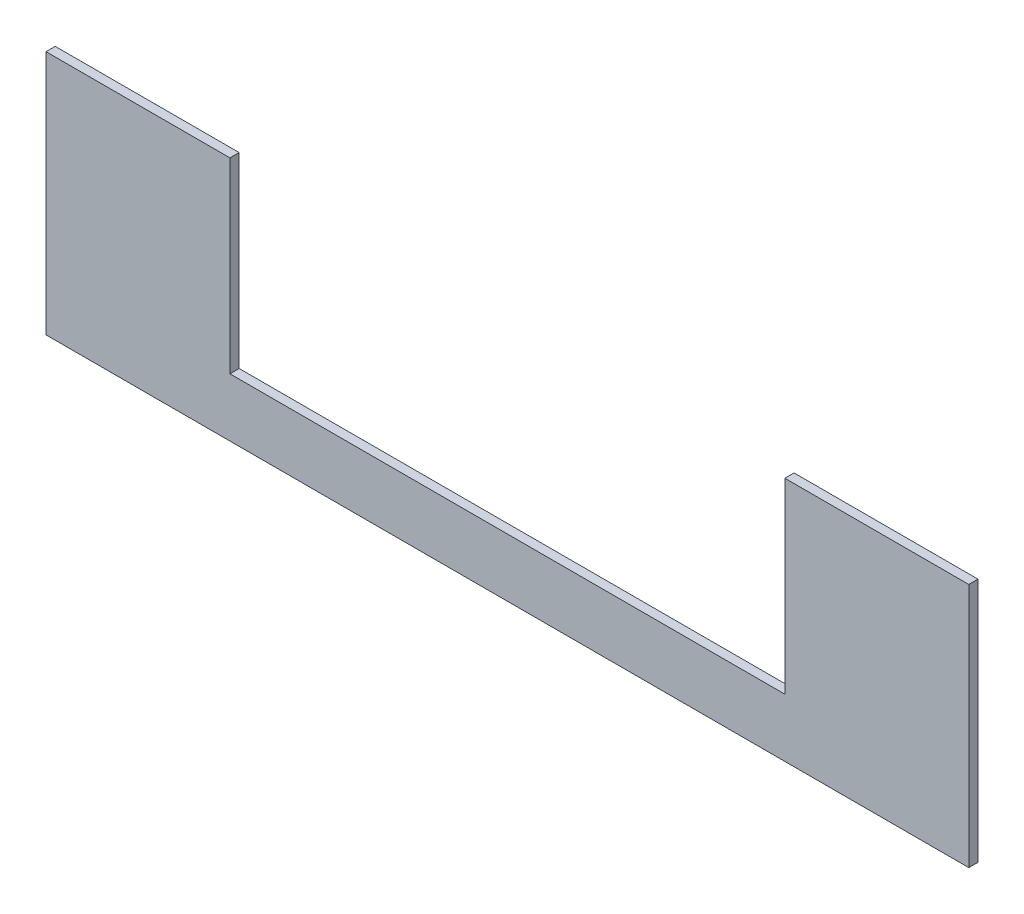
ISO-10303-21;
HEADER;
FILE_DESCRIPTION(('STEP AP214'),'2;1');
FILE_NAME('part.step','',(''),(''),'','','');
FILE_SCHEMA(('AUTOMOTIVE_DESIGN { 1 0 10303 214 1 1 1 1 }'));
ENDSEC;
DATA;
#1=APPLICATION_CONTEXT('core data for automotive mechanical design processes');
#2=APPLICATION_PROTOCOL_DEFINITION('international standard','automotive_design',2000,#1);
#3=PRODUCT_CONTEXT('',#1,'mechanical');
#4=PRODUCT('Part','Part','',(#3));
#5=PRODUCT_RELATED_PRODUCT_CATEGORY('part','',(#4));
#6=PRODUCT_DEFINITION_FORMATION('','',#4);
#7=PRODUCT_DEFINITION_CONTEXT('part definition',#1,'design');
#8=PRODUCT_DEFINITION('design','',#6,#7);
#9=PRODUCT_DEFINITION_SHAPE('','',#8);
#10=(LENGTH_UNIT() NAMED_UNIT(*) SI_UNIT(.MILLI.,.METRE.));
#11=(NAMED_UNIT(*) PLANE_ANGLE_UNIT() SI_UNIT($,.RADIAN.));
#12=(NAMED_UNIT(*) SI_UNIT($,.STERADIAN.) SOLID_ANGLE_UNIT());
#13=UNCERTAINTY_MEASURE_WITH_UNIT(LENGTH_MEASURE(1.E-05),#10,'distance_accuracy_value','');
#14=(GEOMETRIC_REPRESENTATION_CONTEXT(3) GLOBAL_UNCERTAINTY_ASSIGNED_CONTEXT((#13)) GLOBAL_UNIT_ASSIGNED_CONTEXT((#10,
#11,#12)) REPRESENTATION_CONTEXT('',''));
#15=CARTESIAN_POINT('',(0.,0.,0.));
#16=DIRECTION('',(0.,0.,1.));
#17=DIRECTION('',(1.,0.,0.));
#18=AXIS2_PLACEMENT_3D('',#15,#16,#17);
#19=CARTESIAN_POINT('',(0.,80.,3.));
#20=DIRECTION('',(0.,-1.,0.));
#21=DIRECTION('',(1.,0.,0.));
#22=AXIS2_PLACEMENT_3D('',#19,#20,#21);
#23=PLANE('',#22);
#24=DIRECTION('',(-1.,0.,0.));
#25=VECTOR('',#24,1.);
#26=CARTESIAN_POINT('',(0.,80.,3.));
#27=LINE('',#26,#25);
#28=CARTESIAN_POINT('',(-241.,80.,3.));
#29=VERTEX_POINT('',#28);
#30=CARTESIAN_POINT('',(-301.,80.,3.));
#31=VERTEX_POINT('',#30);
#32=EDGE_CURVE('E145',#29,#31,#27,.T.);
#33=ORIENTED_EDGE('',*,*,#32,.F.);
#34=DIRECTION('',(0.,0.,1.));
#35=VECTOR('',#34,1.);
#36=CARTESIAN_POINT('',(-241.,80.,0.));
#37=LINE('',#36,#35);
#38=CARTESIAN_POINT('',(-241.,80.,0.));
#39=VERTEX_POINT('',#38);
#40=EDGE_CURVE('E137',#39,#29,#37,.T.);
#41=ORIENTED_EDGE('',*,*,#40,.F.);
#42=DIRECTION('',(-1.,0.,0.));
#43=VECTOR('',#42,1.);
#44=CARTESIAN_POINT('',(0.,80.,0.));
#45=LINE('',#44,#43);
#46=CARTESIAN_POINT('',(-301.,80.,0.));
#47=VERTEX_POINT('',#46);
#48=EDGE_CURVE('E128',#39,#47,#45,.T.);
#49=ORIENTED_EDGE('',*,*,#48,.T.);
#50=DIRECTION('',(0.,0.,-1.));
#51=VECTOR('',#50,1.);
#52=CARTESIAN_POINT('',(-301.,80.,3.));
#53=LINE('',#52,#51);
#54=EDGE_CURVE('E41',#31,#47,#53,.T.);
#55=ORIENTED_EDGE('',*,*,#54,.F.);
#56=EDGE_LOOP('',(#33,#41,#49,#55));
#57=FACE_BOUND('',#56,.T.);
#58=ADVANCED_FACE('F33',(#57),#23,.F.);
#59=CARTESIAN_POINT('',(0.,0.,3.));
#60=DIRECTION('',(-1.,0.,0.));
#61=DIRECTION('',(0.,-1.,0.));
#62=AXIS2_PLACEMENT_3D('',#59,#60,#61);
#63=PLANE('',#62);
#64=DIRECTION('',(0.,1.,0.));
#65=VECTOR('',#64,1.);
#66=CARTESIAN_POINT('',(0.,0.,0.));
#67=LINE('',#66,#65);
#68=CARTESIAN_POINT('',(0.,0.,0.));
#69=VERTEX_POINT('',#68);
#70=CARTESIAN_POINT('',(0.,80.,0.));
#71=VERTEX_POINT('',#70);
#72=EDGE_CURVE('E139',#69,#71,#67,.T.);
#73=ORIENTED_EDGE('',*,*,#72,.T.);
#74=DIRECTION('',(0.,0.,-1.));
#75=VECTOR('',#74,1.);
#76=CARTESIAN_POINT('',(0.,80.,3.));
#77=LINE('',#76,#75);
#78=CARTESIAN_POINT('',(0.,80.,3.));
#79=VERTEX_POINT('',#78);
#80=EDGE_CURVE('E11',#79,#71,#77,.T.);
#81=ORIENTED_EDGE('',*,*,#80,.F.);
#82=DIRECTION('',(0.,1.,0.));
#83=VECTOR('',#82,1.);
#84=CARTESIAN_POINT('',(0.,0.,3.));
#85=LINE('',#84,#83);
#86=CARTESIAN_POINT('',(0.,0.,3.));
#87=VERTEX_POINT('',#86);
#88=EDGE_CURVE('E143',#87,#79,#85,.T.);
#89=ORIENTED_EDGE('',*,*,#88,.F.);
#90=DIRECTION('',(0.,0.,-1.));
#91=VECTOR('',#90,1.);
#92=CARTESIAN_POINT('',(0.,0.,3.));
#93=LINE('',#92,#91);
#94=EDGE_CURVE('E150',#87,#69,#93,.T.);
#95=ORIENTED_EDGE('',*,*,#94,.T.);
#96=EDGE_LOOP('',(#73,#81,#89,#95));
#97=FACE_BOUND('',#96,.T.);
#98=ADVANCED_FACE('F35',(#97),#63,.F.);
#99=CARTESIAN_POINT('',(-60.,80.,0.));
#100=VERTEX_POINT('',#99);
#101=EDGE_CURVE('E153',#71,#100,#45,.T.);
#102=ORIENTED_EDGE('',*,*,#101,.T.);
#103=DIRECTION('',(0.,0.,1.));
#104=VECTOR('',#103,1.);
#105=CARTESIAN_POINT('',(-60.,80.,0.));
#106=LINE('',#105,#104);
#107=CARTESIAN_POINT('',(-60.,80.,3.));
#108=VERTEX_POINT('',#107);
#109=EDGE_CURVE('E140',#100,#108,#106,.T.);
#110=ORIENTED_EDGE('',*,*,#109,.T.);
#111=EDGE_CURVE('E85',#79,#108,#27,.T.);
#112=ORIENTED_EDGE('',*,*,#111,.F.);
#113=ORIENTED_EDGE('',*,*,#80,.T.);
#114=EDGE_LOOP('',(#102,#110,#112,#113));
#115=FACE_BOUND('',#114,.T.);
#116=ADVANCED_FACE('F182',(#115),#23,.F.);
#117=CARTESIAN_POINT('',(-301.,0.,3.));
#118=DIRECTION('',(1.,0.,0.));
#119=DIRECTION('',(0.,0.,-1.));
#120=AXIS2_PLACEMENT_3D('',#117,#118,#119);
#121=PLANE('',#120);
#122=DIRECTION('',(0.,-1.,0.));
#123=VECTOR('',#122,1.);
#124=CARTESIAN_POINT('',(-301.,0.,0.));
#125=LINE('',#124,#123);
#126=CARTESIAN_POINT('',(-301.,0.,0.));
#127=VERTEX_POINT('',#126);
#128=EDGE_CURVE('E156',#47,#127,#125,.T.);
#129=ORIENTED_EDGE('',*,*,#128,.T.);
#130=DIRECTION('',(0.,0.,-1.));
#131=VECTOR('',#130,1.);
#132=CARTESIAN_POINT('',(-301.,0.,3.));
#133=LINE('',#132,#131);
#134=CARTESIAN_POINT('',(-301.,0.,3.));
#135=VERTEX_POINT('',#134);
#136=EDGE_CURVE('E160',#135,#127,#133,.T.);
#137=ORIENTED_EDGE('',*,*,#136,.F.);
#138=DIRECTION('',(0.,-1.,0.));
#139=VECTOR('',#138,1.);
#140=CARTESIAN_POINT('',(-301.,0.,3.));
#141=LINE('',#140,#139);
#142=EDGE_CURVE('E147',#31,#135,#141,.T.);
#143=ORIENTED_EDGE('',*,*,#142,.F.);
#144=ORIENTED_EDGE('',*,*,#54,.T.);
#145=EDGE_LOOP('',(#129,#137,#143,#144));
#146=FACE_BOUND('',#145,.T.);
#147=ADVANCED_FACE('F165',(#146),#121,.F.);
#148=CARTESIAN_POINT('',(0.,0.,3.));
#149=DIRECTION('',(0.,1.,0.));
#150=DIRECTION('',(-1.,0.,0.));
#151=AXIS2_PLACEMENT_3D('',#148,#149,#150);
#152=PLANE('',#151);
#153=DIRECTION('',(1.,0.,0.));
#154=VECTOR('',#153,1.);
#155=CARTESIAN_POINT('',(0.,0.,0.));
#156=LINE('',#155,#154);
#157=EDGE_CURVE('E78',#127,#69,#156,.T.);
#158=ORIENTED_EDGE('',*,*,#157,.T.);
#159=ORIENTED_EDGE('',*,*,#94,.F.);
#160=DIRECTION('',(1.,0.,0.));
#161=VECTOR('',#160,1.);
#162=CARTESIAN_POINT('',(0.,0.,3.));
#163=LINE('',#162,#161);
#164=EDGE_CURVE('E57',#135,#87,#163,.T.);
#165=ORIENTED_EDGE('',*,*,#164,.F.);
#166=ORIENTED_EDGE('',*,*,#136,.T.);
#167=EDGE_LOOP('',(#158,#159,#165,#166));
#168=FACE_BOUND('',#167,.T.);
#169=ADVANCED_FACE('F173',(#168),#152,.F.);
#170=CARTESIAN_POINT('',(0.,0.,3.));
#171=DIRECTION('',(0.,0.,1.));
#172=DIRECTION('',(1.,0.,0.));
#173=AXIS2_PLACEMENT_3D('',#170,#171,#172);
#174=PLANE('',#173);
#175=DIRECTION('',(0.,-1.,0.));
#176=VECTOR('',#175,1.);
#177=CARTESIAN_POINT('',(-241.,80.,3.));
#178=LINE('',#177,#176);
#179=CARTESIAN_POINT('',(-241.,19.,3.));
#180=VERTEX_POINT('',#179);
#181=EDGE_CURVE('E114',#29,#180,#178,.T.);
#182=ORIENTED_EDGE('',*,*,#181,.F.);
#183=ORIENTED_EDGE('',*,*,#32,.T.);
#184=ORIENTED_EDGE('',*,*,#142,.T.);
#185=ORIENTED_EDGE('',*,*,#164,.T.);
#186=ORIENTED_EDGE('',*,*,#88,.T.);
#187=ORIENTED_EDGE('',*,*,#111,.T.);
#188=DIRECTION('',(0.,1.,0.));
#189=VECTOR('',#188,1.);
#190=CARTESIAN_POINT('',(-60.,80.,3.));
#191=LINE('',#190,#189);
#192=CARTESIAN_POINT('',(-60.,19.,3.));
#193=VERTEX_POINT('',#192);
#194=EDGE_CURVE('E129',#193,#108,#191,.T.);
#195=ORIENTED_EDGE('',*,*,#194,.F.);
#196=DIRECTION('',(1.,0.,0.));
#197=VECTOR('',#196,1.);
#198=CARTESIAN_POINT('',(-241.,19.,3.));
#199=LINE('',#198,#197);
#200=EDGE_CURVE('E131',#180,#193,#199,.T.);
#201=ORIENTED_EDGE('',*,*,#200,.F.);
#202=EDGE_LOOP('',(#182,#183,#184,#185,#186,#187,#195,#201));
#203=FACE_BOUND('',#202,.T.);
#204=ADVANCED_FACE('F175',(#203),#174,.T.);
#205=CARTESIAN_POINT('',(0.,0.,0.));
#206=DIRECTION('',(0.,0.,1.));
#207=DIRECTION('',(1.,0.,0.));
#208=AXIS2_PLACEMENT_3D('',#205,#206,#207);
#209=PLANE('',#208);
#210=ORIENTED_EDGE('',*,*,#48,.F.);
#211=DIRECTION('',(0.,-1.,0.));
#212=VECTOR('',#211,1.);
#213=CARTESIAN_POINT('',(-241.,80.,0.));
#214=LINE('',#213,#212);
#215=CARTESIAN_POINT('',(-241.,19.,0.));
#216=VERTEX_POINT('',#215);
#217=EDGE_CURVE('E111',#39,#216,#214,.T.);
#218=ORIENTED_EDGE('',*,*,#217,.T.);
#219=DIRECTION('',(1.,0.,0.));
#220=VECTOR('',#219,1.);
#221=CARTESIAN_POINT('',(-241.,19.,0.));
#222=LINE('',#221,#220);
#223=CARTESIAN_POINT('',(-60.,19.,0.));
#224=VERTEX_POINT('',#223);
#225=EDGE_CURVE('E121',#216,#224,#222,.T.);
#226=ORIENTED_EDGE('',*,*,#225,.T.);
#227=DIRECTION('',(0.,1.,0.));
#228=VECTOR('',#227,1.);
#229=CARTESIAN_POINT('',(-60.,80.,0.));
#230=LINE('',#229,#228);
#231=EDGE_CURVE('E48',#224,#100,#230,.T.);
#232=ORIENTED_EDGE('',*,*,#231,.T.);
#233=ORIENTED_EDGE('',*,*,#101,.F.);
#234=ORIENTED_EDGE('',*,*,#72,.F.);
#235=ORIENTED_EDGE('',*,*,#157,.F.);
#236=ORIENTED_EDGE('',*,*,#128,.F.);
#237=EDGE_LOOP('',(#210,#218,#226,#232,#233,#234,#235,#236));
#238=FACE_BOUND('',#237,.T.);
#239=ADVANCED_FACE('F126',(#238),#209,.F.);
#240=CARTESIAN_POINT('',(-241.,80.,0.));
#241=DIRECTION('',(-1.,0.,0.));
#242=DIRECTION('',(0.,0.,1.));
#243=AXIS2_PLACEMENT_3D('',#240,#241,#242);
#244=PLANE('',#243);
#245=ORIENTED_EDGE('',*,*,#181,.T.);
#246=DIRECTION('',(0.,0.,1.));
#247=VECTOR('',#246,1.);
#248=CARTESIAN_POINT('',(-241.,19.,0.));
#249=LINE('',#248,#247);
#250=EDGE_CURVE('E107',#216,#180,#249,.T.);
#251=ORIENTED_EDGE('',*,*,#250,.F.);
#252=ORIENTED_EDGE('',*,*,#217,.F.);
#253=ORIENTED_EDGE('',*,*,#40,.T.);
#254=EDGE_LOOP('',(#245,#251,#252,#253));
#255=FACE_BOUND('',#254,.T.);
#256=ADVANCED_FACE('F109',(#255),#244,.F.);
#257=CARTESIAN_POINT('',(-60.,80.,0.));
#258=DIRECTION('',(1.,0.,0.));
#259=DIRECTION('',(0.,0.,-1.));
#260=AXIS2_PLACEMENT_3D('',#257,#258,#259);
#261=PLANE('',#260);
#262=ORIENTED_EDGE('',*,*,#194,.T.);
#263=ORIENTED_EDGE('',*,*,#109,.F.);
#264=ORIENTED_EDGE('',*,*,#231,.F.);
#265=DIRECTION('',(0.,0.,1.));
#266=VECTOR('',#265,1.);
#267=CARTESIAN_POINT('',(-60.,19.,0.));
#268=LINE('',#267,#266);
#269=EDGE_CURVE('E118',#224,#193,#268,.T.);
#270=ORIENTED_EDGE('',*,*,#269,.T.);
#271=EDGE_LOOP('',(#262,#263,#264,#270));
#272=FACE_BOUND('',#271,.T.);
#273=ADVANCED_FACE('F193',(#272),#261,.F.);
#274=CARTESIAN_POINT('',(-241.,19.,0.));
#275=DIRECTION('',(0.,-1.,0.));
#276=DIRECTION('',(0.,0.,-1.));
#277=AXIS2_PLACEMENT_3D('',#274,#275,#276);
#278=PLANE('',#277);
#279=ORIENTED_EDGE('',*,*,#200,.T.);
#280=ORIENTED_EDGE('',*,*,#269,.F.);
#281=ORIENTED_EDGE('',*,*,#225,.F.);
#282=ORIENTED_EDGE('',*,*,#250,.T.);
#283=EDGE_LOOP('',(#279,#280,#281,#282));
#284=FACE_BOUND('',#283,.T.);
#285=ADVANCED_FACE('F122',(#284),#278,.F.);
#286=CLOSED_SHELL('',(#58,#98,#116,#147,#169,#204,#239,#256,#273,#285));
#287=MANIFOLD_SOLID_BREP('B2',#286);
#288=ADVANCED_BREP_SHAPE_REPRESENTATION('',(#18,#287),#14);
#289=SHAPE_DEFINITION_REPRESENTATION(#9,#288);
ENDSEC;
END-ISO-10303-21;
